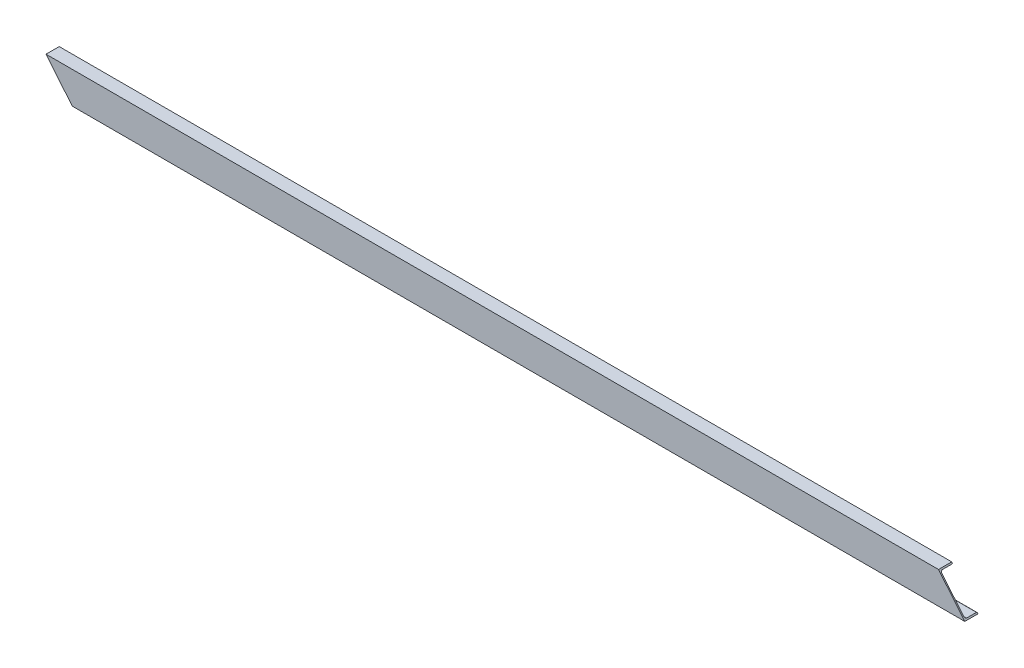
ISO-10303-21;
HEADER;
FILE_DESCRIPTION(('STEP AP214'),'2;1');
FILE_NAME('part.step','',(''),(''),'','','');
FILE_SCHEMA(('AUTOMOTIVE_DESIGN { 1 0 10303 214 1 1 1 1 }'));
ENDSEC;
DATA;
#1=APPLICATION_CONTEXT('core data for automotive mechanical design processes');
#2=APPLICATION_PROTOCOL_DEFINITION('international standard','automotive_design',2000,#1);
#3=PRODUCT_CONTEXT('',#1,'mechanical');
#4=PRODUCT('Part','Part','',(#3));
#5=PRODUCT_RELATED_PRODUCT_CATEGORY('part','',(#4));
#6=PRODUCT_DEFINITION_FORMATION('','',#4);
#7=PRODUCT_DEFINITION_CONTEXT('part definition',#1,'design');
#8=PRODUCT_DEFINITION('design','',#6,#7);
#9=PRODUCT_DEFINITION_SHAPE('','',#8);
#10=(LENGTH_UNIT() NAMED_UNIT(*) SI_UNIT(.MILLI.,.METRE.));
#11=(NAMED_UNIT(*) PLANE_ANGLE_UNIT() SI_UNIT($,.RADIAN.));
#12=(NAMED_UNIT(*) SI_UNIT($,.STERADIAN.) SOLID_ANGLE_UNIT());
#13=UNCERTAINTY_MEASURE_WITH_UNIT(LENGTH_MEASURE(1.E-05),#10,'distance_accuracy_value','');
#14=(GEOMETRIC_REPRESENTATION_CONTEXT(3) GLOBAL_UNCERTAINTY_ASSIGNED_CONTEXT((#13)) GLOBAL_UNIT_ASSIGNED_CONTEXT((#10,
#11,#12)) REPRESENTATION_CONTEXT('',''));
#15=CARTESIAN_POINT('',(0.,0.,0.));
#16=DIRECTION('',(0.,0.,1.));
#17=DIRECTION('',(1.,0.,0.));
#18=AXIS2_PLACEMENT_3D('',#15,#16,#17);
#19=CARTESIAN_POINT('',(4151.72857768436,-147.156136611384,58.));
#20=DIRECTION('',(0.,0.,-1.));
#21=DIRECTION('',(0.,1.,0.));
#22=AXIS2_PLACEMENT_3D('',#19,#20,#21);
#23=PLANE('',#22);
#24=DIRECTION('',(-1.,0.,0.));
#25=VECTOR('',#24,1.);
#26=CARTESIAN_POINT('',(4151.72857768436,-7.15613661138373,58.));
#27=LINE('',#26,#25);
#28=CARTESIAN_POINT('',(3920.04128798324,-7.15613661138372,58.));
#29=VERTEX_POINT('',#28);
#30=CARTESIAN_POINT('',(0.,-7.15613661138373,58.));
#31=VERTEX_POINT('',#30);
#32=EDGE_CURVE('E158',#29,#31,#27,.T.);
#33=ORIENTED_EDGE('',*,*,#32,.T.);
#34=DIRECTION('',(-0.636154901199818,0.771561366113837,0.));
#35=VECTOR('',#34,1.);
#36=CARTESIAN_POINT('',(0.,-7.15613661138373,58.));
#37=LINE('',#36,#35);
#38=CARTESIAN_POINT('',(115.430463576159,-147.156136611384,58.));
#39=VERTEX_POINT('',#38);
#40=EDGE_CURVE('E135',#39,#31,#37,.T.);
#41=ORIENTED_EDGE('',*,*,#40,.F.);
#42=DIRECTION('',(-1.,0.,0.));
#43=VECTOR('',#42,1.);
#44=CARTESIAN_POINT('',(4151.72857768436,-147.156136611384,58.));
#45=LINE('',#44,#43);
#46=CARTESIAN_POINT('',(4035.47175155939,-147.156136611384,58.));
#47=VERTEX_POINT('',#46);
#48=EDGE_CURVE('E141',#47,#39,#45,.T.);
#49=ORIENTED_EDGE('',*,*,#48,.F.);
#50=DIRECTION('',(-0.636154901199819,0.771561366113836,0.));
#51=VECTOR('',#50,1.);
#52=CARTESIAN_POINT('',(4082.52008207455,-204.21877040888,58.));
#53=LINE('',#52,#51);
#54=EDGE_CURVE('E44',#47,#29,#53,.T.);
#55=ORIENTED_EDGE('',*,*,#54,.T.);
#56=EDGE_LOOP('',(#33,#41,#49,#55));
#57=FACE_BOUND('',#56,.T.);
#58=ADVANCED_FACE('F40',(#57),#23,.F.);
#59=CARTESIAN_POINT('',(4151.72857768436,-7.15613661138373,58.));
#60=DIRECTION('',(0.,-1.,0.));
#61=DIRECTION('',(0.,0.,-1.));
#62=AXIS2_PLACEMENT_3D('',#59,#60,#61);
#63=PLANE('',#62);
#64=ORIENTED_EDGE('',*,*,#32,.F.);
#65=DIRECTION('',(0.,0.,-1.));
#66=VECTOR('',#65,1.);
#67=CARTESIAN_POINT('',(3920.04128798324,-7.15613661138373,57.9999999999999));
#68=LINE('',#67,#66);
#69=CARTESIAN_POINT('',(3920.04128798324,-7.15613661138376,0.));
#70=VERTEX_POINT('',#69);
#71=EDGE_CURVE('E156',#29,#70,#68,.T.);
#72=ORIENTED_EDGE('',*,*,#71,.T.);
#73=DIRECTION('',(-1.,0.,0.));
#74=VECTOR('',#73,1.);
#75=CARTESIAN_POINT('',(4151.72857768436,-7.15613661138376,0.));
#76=LINE('',#75,#74);
#77=CARTESIAN_POINT('',(0.,-7.15613661138373,0.));
#78=VERTEX_POINT('',#77);
#79=EDGE_CURVE('E149',#70,#78,#76,.T.);
#80=ORIENTED_EDGE('',*,*,#79,.T.);
#81=DIRECTION('',(0.,0.,1.));
#82=VECTOR('',#81,1.);
#83=CARTESIAN_POINT('',(0.,-7.15613661138373,58.));
#84=LINE('',#83,#82);
#85=EDGE_CURVE('E129',#78,#31,#84,.T.);
#86=ORIENTED_EDGE('',*,*,#85,.T.);
#87=EDGE_LOOP('',(#64,#72,#80,#86));
#88=FACE_BOUND('',#87,.T.);
#89=ADVANCED_FACE('F155',(#88),#63,.F.);
#90=CARTESIAN_POINT('',(4151.72857768436,-7.15613661138376,0.));
#91=DIRECTION('',(0.,0.,1.));
#92=DIRECTION('',(0.,-1.,0.));
#93=AXIS2_PLACEMENT_3D('',#90,#91,#92);
#94=PLANE('',#93);
#95=DIRECTION('',(-1.,0.,0.));
#96=VECTOR('',#95,1.);
#97=CARTESIAN_POINT('',(4151.72857768436,-9.05613661138375,0.));
#98=LINE('',#97,#96);
#99=CARTESIAN_POINT('',(3921.60784427463,-9.05613661138375,0.));
#100=VERTEX_POINT('',#99);
#101=CARTESIAN_POINT('',(1.56655629139103,-9.05613661138387,0.));
#102=VERTEX_POINT('',#101);
#103=EDGE_CURVE('E152',#100,#102,#98,.T.);
#104=ORIENTED_EDGE('',*,*,#103,.T.);
#105=DIRECTION('',(-0.636154901199818,0.771561366113837,0.));
#106=VECTOR('',#105,1.);
#107=CARTESIAN_POINT('',(0.,-7.15613661138373,0.));
#108=LINE('',#107,#106);
#109=EDGE_CURVE('E132',#102,#78,#108,.T.);
#110=ORIENTED_EDGE('',*,*,#109,.T.);
#111=ORIENTED_EDGE('',*,*,#79,.F.);
#112=DIRECTION('',(0.636154901199819,-0.771561366113836,0.));
#113=VECTOR('',#112,1.);
#114=CARTESIAN_POINT('',(4013.80352582638,-120.875798573757,-2.00716019029014E-13));
#115=LINE('',#114,#113);
#116=EDGE_CURVE('E206',#70,#100,#115,.T.);
#117=ORIENTED_EDGE('',*,*,#116,.T.);
#118=EDGE_LOOP('',(#104,#110,#111,#117));
#119=FACE_BOUND('',#118,.T.);
#120=ADVANCED_FACE('F147',(#119),#94,.F.);
#121=CARTESIAN_POINT('',(4151.72857768436,-9.05613661138375,3.00000000000001));
#122=DIRECTION('',(-1.,0.,0.));
#123=DIRECTION('',(0.,0.,1.));
#124=AXIS2_PLACEMENT_3D('',#121,#122,#123);
#125=CYLINDRICAL_SURFACE('',#124,3.);
#126=DIRECTION('',(-1.,0.,0.));
#127=VECTOR('',#126,1.);
#128=CARTESIAN_POINT('',(4151.72857768436,-12.0561366113838,3.00000000000001));
#129=LINE('',#128,#127);
#130=CARTESIAN_POINT('',(3924.0813542084,-12.0561366113838,3.00000000000001));
#131=VERTEX_POINT('',#130);
#132=CARTESIAN_POINT('',(4.04006622516562,-12.0561366113838,3.00000000000001));
#133=VERTEX_POINT('',#132);
#134=EDGE_CURVE('E163',#131,#133,#129,.T.);
#135=ORIENTED_EDGE('',*,*,#134,.T.);
#136=CARTESIAN_POINT('',(1.56655629139024,-9.05613661138375,3.00000000000001));
#137=DIRECTION('',(0.771561366113837,0.636154901199818,0.));
#138=DIRECTION('',(-0.636154901199818,0.771561366113837,0.));
#139=AXIS2_PLACEMENT_3D('',#136,#137,#138);
#140=ELLIPSE('',#139,3.88821956587881,3.);
#141=EDGE_CURVE('E142',#133,#102,#140,.T.);
#142=ORIENTED_EDGE('',*,*,#141,.T.);
#143=ORIENTED_EDGE('',*,*,#103,.F.);
#144=CARTESIAN_POINT('',(3921.60784427463,-9.05613661138375,3.00000000000001));
#145=DIRECTION('',(-0.771561366113836,-0.636154901199819,0.));
#146=DIRECTION('',(-0.636154901199819,0.771561366113836,0.));
#147=AXIS2_PLACEMENT_3D('',#144,#145,#146);
#148=ELLIPSE('',#147,3.88821956587881,3.);
#149=EDGE_CURVE('E210',#100,#131,#148,.T.);
#150=ORIENTED_EDGE('',*,*,#149,.T.);
#151=EDGE_LOOP('',(#135,#142,#143,#150));
#152=FACE_BOUND('',#151,.T.);
#153=ADVANCED_FACE('F282',(#152),#125,.T.);
#154=CARTESIAN_POINT('',(4151.72857768436,-12.0561366113838,3.00000000000001));
#155=DIRECTION('',(0.,1.,0.));
#156=DIRECTION('',(0.,0.,1.));
#157=AXIS2_PLACEMENT_3D('',#154,#155,#156);
#158=PLANE('',#157);
#159=DIRECTION('',(-1.,0.,0.));
#160=VECTOR('',#159,1.);
#161=CARTESIAN_POINT('',(4151.72857768436,-12.0561366113838,45.1));
#162=LINE('',#161,#160);
#163=CARTESIAN_POINT('',(3924.0813542084,-12.0561366113838,45.1));
#164=VERTEX_POINT('',#163);
#165=CARTESIAN_POINT('',(4.04006622516562,-12.0561366113838,45.1));
#166=VERTEX_POINT('',#165);
#167=EDGE_CURVE('E171',#164,#166,#162,.T.);
#168=ORIENTED_EDGE('',*,*,#167,.T.);
#169=DIRECTION('',(0.,0.,-1.));
#170=VECTOR('',#169,1.);
#171=CARTESIAN_POINT('',(4.04006622516562,-12.0561366113838,3.00000000000114));
#172=LINE('',#171,#170);
#173=EDGE_CURVE('E273',#166,#133,#172,.T.);
#174=ORIENTED_EDGE('',*,*,#173,.T.);
#175=ORIENTED_EDGE('',*,*,#134,.F.);
#176=DIRECTION('',(0.,0.,1.));
#177=VECTOR('',#176,1.);
#178=CARTESIAN_POINT('',(3924.0813542084,-12.0561366113838,3.00000000000007));
#179=LINE('',#178,#177);
#180=EDGE_CURVE('E218',#131,#164,#179,.T.);
#181=ORIENTED_EDGE('',*,*,#180,.T.);
#182=EDGE_LOOP('',(#168,#174,#175,#181));
#183=FACE_BOUND('',#182,.T.);
#184=ADVANCED_FACE('F287',(#183),#158,.F.);
#185=CARTESIAN_POINT('',(4151.72857768436,-20.0561366113838,45.1));
#186=DIRECTION('',(-1.,0.,0.));
#187=DIRECTION('',(0.,0.,1.));
#188=AXIS2_PLACEMENT_3D('',#185,#186,#187);
#189=CYLINDRICAL_SURFACE('',#188,8.);
#190=DIRECTION('',(-1.,0.,0.));
#191=VECTOR('',#190,1.);
#192=CARTESIAN_POINT('',(4151.72857768436,-20.0561366113838,53.1));
#193=LINE('',#192,#191);
#194=CARTESIAN_POINT('',(3930.67738069847,-20.0561366113838,53.1));
#195=VERTEX_POINT('',#194);
#196=CARTESIAN_POINT('',(10.636092715232,-20.0561366113838,53.1));
#197=VERTEX_POINT('',#196);
#198=EDGE_CURVE('E175',#195,#197,#193,.T.);
#199=ORIENTED_EDGE('',*,*,#198,.T.);
#200=CARTESIAN_POINT('',(10.6360927152318,-20.0561366113838,45.1));
#201=DIRECTION('',(0.771561366113837,0.636154901199818,0.));
#202=DIRECTION('',(-0.636154901199818,0.771561366113837,0.));
#203=AXIS2_PLACEMENT_3D('',#200,#201,#202);
#204=ELLIPSE('',#203,10.3685855090101,8.);
#205=EDGE_CURVE('E270',#197,#166,#204,.F.);
#206=ORIENTED_EDGE('',*,*,#205,.T.);
#207=ORIENTED_EDGE('',*,*,#167,.F.);
#208=CARTESIAN_POINT('',(3930.67738069847,-20.0561366113838,45.1));
#209=DIRECTION('',(-0.771561366113836,-0.636154901199819,0.));
#210=DIRECTION('',(-0.636154901199819,0.771561366113836,0.));
#211=AXIS2_PLACEMENT_3D('',#208,#209,#210);
#212=ELLIPSE('',#211,10.3685855090101,8.);
#213=EDGE_CURVE('E222',#164,#195,#212,.F.);
#214=ORIENTED_EDGE('',*,*,#213,.T.);
#215=EDGE_LOOP('',(#199,#206,#207,#214));
#216=FACE_BOUND('',#215,.T.);
#217=ADVANCED_FACE('F285',(#216),#189,.F.);
#218=CARTESIAN_POINT('',(4151.72857768436,-20.0561366113838,53.1));
#219=DIRECTION('',(0.,0.,1.));
#220=DIRECTION('',(0.,-1.,0.));
#221=AXIS2_PLACEMENT_3D('',#218,#219,#220);
#222=PLANE('',#221);
#223=DIRECTION('',(-1.,0.,0.));
#224=VECTOR('',#223,1.);
#225=CARTESIAN_POINT('',(4151.72857768436,-134.256136611384,53.1));
#226=LINE('',#225,#224);
#227=CARTESIAN_POINT('',(4024.83565884416,-134.256136611384,53.1));
#228=VERTEX_POINT('',#227);
#229=CARTESIAN_POINT('',(104.794370860926,-134.256136611384,53.1));
#230=VERTEX_POINT('',#229);
#231=EDGE_CURVE('E179',#228,#230,#226,.T.);
#232=ORIENTED_EDGE('',*,*,#231,.T.);
#233=DIRECTION('',(-0.636154901199818,0.771561366113837,0.));
#234=VECTOR('',#233,1.);
#235=CARTESIAN_POINT('',(1686.50747524564,-2052.63909855589,53.0999999999999));
#236=LINE('',#235,#234);
#237=EDGE_CURVE('E266',#230,#197,#236,.T.);
#238=ORIENTED_EDGE('',*,*,#237,.T.);
#239=ORIENTED_EDGE('',*,*,#198,.F.);
#240=DIRECTION('',(0.636154901199819,-0.771561366113836,0.));
#241=VECTOR('',#240,1.);
#242=CARTESIAN_POINT('',(4020.13526565211,-128.555258121422,53.1));
#243=LINE('',#242,#241);
#244=EDGE_CURVE('E226',#195,#228,#243,.T.);
#245=ORIENTED_EDGE('',*,*,#244,.T.);
#246=EDGE_LOOP('',(#232,#238,#239,#245));
#247=FACE_BOUND('',#246,.T.);
#248=ADVANCED_FACE('F291',(#247),#222,.F.);
#249=CARTESIAN_POINT('',(4151.72857768436,-134.256136611384,45.1));
#250=DIRECTION('',(-1.,0.,0.));
#251=DIRECTION('',(0.,0.,1.));
#252=AXIS2_PLACEMENT_3D('',#249,#250,#251);
#253=CYLINDRICAL_SURFACE('',#252,7.99999999999999);
#254=DIRECTION('',(-1.,0.,0.));
#255=VECTOR('',#254,1.);
#256=CARTESIAN_POINT('',(4151.72857768436,-142.256136611384,45.1));
#257=LINE('',#256,#255);
#258=CARTESIAN_POINT('',(4031.43168533423,-142.256136611384,45.1));
#259=VERTEX_POINT('',#258);
#260=CARTESIAN_POINT('',(111.390397350993,-142.256136611384,45.1));
#261=VERTEX_POINT('',#260);
#262=EDGE_CURVE('E183',#259,#261,#257,.T.);
#263=ORIENTED_EDGE('',*,*,#262,.T.);
#264=CARTESIAN_POINT('',(104.794370860926,-134.256136611384,45.1));
#265=DIRECTION('',(0.771561366113837,0.636154901199818,0.));
#266=DIRECTION('',(-0.636154901199818,0.771561366113837,0.));
#267=AXIS2_PLACEMENT_3D('',#264,#265,#266);
#268=ELLIPSE('',#267,10.3685855090101,7.99999999999999);
#269=EDGE_CURVE('E262',#261,#230,#268,.F.);
#270=ORIENTED_EDGE('',*,*,#269,.T.);
#271=ORIENTED_EDGE('',*,*,#231,.F.);
#272=CARTESIAN_POINT('',(4024.83565884416,-134.256136611384,45.1));
#273=DIRECTION('',(-0.771561366113836,-0.636154901199819,0.));
#274=DIRECTION('',(-0.636154901199819,0.771561366113836,0.));
#275=AXIS2_PLACEMENT_3D('',#272,#273,#274);
#276=ELLIPSE('',#275,10.3685855090101,7.99999999999999);
#277=EDGE_CURVE('E230',#228,#259,#276,.F.);
#278=ORIENTED_EDGE('',*,*,#277,.T.);
#279=EDGE_LOOP('',(#263,#270,#271,#278));
#280=FACE_BOUND('',#279,.T.);
#281=ADVANCED_FACE('F293',(#280),#253,.F.);
#282=CARTESIAN_POINT('',(4151.72857768436,-142.256136611384,3.00000000000002));
#283=DIRECTION('',(0.,-1.,0.));
#284=DIRECTION('',(0.,0.,-1.));
#285=AXIS2_PLACEMENT_3D('',#282,#283,#284);
#286=PLANE('',#285);
#287=DIRECTION('',(-1.,0.,0.));
#288=VECTOR('',#287,1.);
#289=CARTESIAN_POINT('',(4151.72857768436,-142.256136611384,3.00000000000002));
#290=LINE('',#289,#288);
#291=CARTESIAN_POINT('',(4031.43168533423,-142.256136611384,3.00000000000002));
#292=VERTEX_POINT('',#291);
#293=CARTESIAN_POINT('',(111.390397350993,-142.256136611384,3.00000000000002));
#294=VERTEX_POINT('',#293);
#295=EDGE_CURVE('E187',#292,#294,#290,.T.);
#296=ORIENTED_EDGE('',*,*,#295,.T.);
#297=DIRECTION('',(0.,0.,1.));
#298=VECTOR('',#297,1.);
#299=CARTESIAN_POINT('',(111.390397350993,-142.256136611384,2.99999999999343));
#300=LINE('',#299,#298);
#301=EDGE_CURVE('E258',#294,#261,#300,.T.);
#302=ORIENTED_EDGE('',*,*,#301,.T.);
#303=ORIENTED_EDGE('',*,*,#262,.F.);
#304=DIRECTION('',(0.,0.,-1.));
#305=VECTOR('',#304,1.);
#306=CARTESIAN_POINT('',(4031.43168533423,-142.256136611384,2.99999999999982));
#307=LINE('',#306,#305);
#308=EDGE_CURVE('E234',#259,#292,#307,.T.);
#309=ORIENTED_EDGE('',*,*,#308,.T.);
#310=EDGE_LOOP('',(#296,#302,#303,#309));
#311=FACE_BOUND('',#310,.T.);
#312=ADVANCED_FACE('F296',(#311),#286,.F.);
#313=CARTESIAN_POINT('',(4151.72857768436,-145.256136611384,3.00000000000002));
#314=DIRECTION('',(-1.,0.,0.));
#315=DIRECTION('',(0.,0.,1.));
#316=AXIS2_PLACEMENT_3D('',#313,#314,#315);
#317=CYLINDRICAL_SURFACE('',#316,3.);
#318=DIRECTION('',(-1.,0.,0.));
#319=VECTOR('',#318,1.);
#320=CARTESIAN_POINT('',(4151.72857768436,-145.256136611384,0.));
#321=LINE('',#320,#319);
#322=CARTESIAN_POINT('',(4033.905195268,-145.256136611384,0.));
#323=VERTEX_POINT('',#322);
#324=CARTESIAN_POINT('',(113.863907284768,-145.256136611383,0.));
#325=VERTEX_POINT('',#324);
#326=EDGE_CURVE('E191',#323,#325,#321,.T.);
#327=ORIENTED_EDGE('',*,*,#326,.T.);
#328=CARTESIAN_POINT('',(113.863907284768,-145.256136611384,3.00000000000002));
#329=DIRECTION('',(0.771561366113837,0.636154901199818,0.));
#330=DIRECTION('',(-0.636154901199818,0.771561366113837,0.));
#331=AXIS2_PLACEMENT_3D('',#328,#329,#330);
#332=ELLIPSE('',#331,3.8882195658788,3.);
#333=EDGE_CURVE('E254',#325,#294,#332,.T.);
#334=ORIENTED_EDGE('',*,*,#333,.T.);
#335=ORIENTED_EDGE('',*,*,#295,.F.);
#336=CARTESIAN_POINT('',(4033.905195268,-145.256136611384,3.00000000000002));
#337=DIRECTION('',(-0.771561366113836,-0.636154901199819,0.));
#338=DIRECTION('',(-0.636154901199819,0.771561366113836,0.));
#339=AXIS2_PLACEMENT_3D('',#336,#337,#338);
#340=ELLIPSE('',#339,3.88821956587881,3.);
#341=EDGE_CURVE('E238',#292,#323,#340,.T.);
#342=ORIENTED_EDGE('',*,*,#341,.T.);
#343=EDGE_LOOP('',(#327,#334,#335,#342));
#344=FACE_BOUND('',#343,.T.);
#345=ADVANCED_FACE('F299',(#344),#317,.T.);
#346=CARTESIAN_POINT('',(4151.72857768436,-147.156136611384,0.));
#347=DIRECTION('',(0.,0.,1.));
#348=DIRECTION('',(0.,-1.,0.));
#349=AXIS2_PLACEMENT_3D('',#346,#347,#348);
#350=PLANE('',#349);
#351=DIRECTION('',(-1.,0.,0.));
#352=VECTOR('',#351,1.);
#353=CARTESIAN_POINT('',(4151.72857768436,-147.156136611384,0.));
#354=LINE('',#353,#352);
#355=CARTESIAN_POINT('',(4035.47175155939,-147.156136611384,0.));
#356=VERTEX_POINT('',#355);
#357=CARTESIAN_POINT('',(115.430463576159,-147.156136611384,0.));
#358=VERTEX_POINT('',#357);
#359=EDGE_CURVE('E194',#356,#358,#354,.T.);
#360=ORIENTED_EDGE('',*,*,#359,.T.);
#361=EDGE_CURVE('E58',#358,#325,#108,.T.);
#362=ORIENTED_EDGE('',*,*,#361,.T.);
#363=ORIENTED_EDGE('',*,*,#326,.F.);
#364=DIRECTION('',(0.636154901199819,-0.771561366113836,0.));
#365=VECTOR('',#364,1.);
#366=CARTESIAN_POINT('',(4082.52008207455,-204.21877040888,-6.25186676523692E-13));
#367=LINE('',#366,#365);
#368=EDGE_CURVE('E50',#323,#356,#367,.T.);
#369=ORIENTED_EDGE('',*,*,#368,.T.);
#370=EDGE_LOOP('',(#360,#362,#363,#369));
#371=FACE_BOUND('',#370,.T.);
#372=ADVANCED_FACE('F300',(#371),#350,.F.);
#373=CARTESIAN_POINT('',(4151.72857768436,-147.156136611384,58.));
#374=DIRECTION('',(0.,1.,0.));
#375=DIRECTION('',(0.,0.,1.));
#376=AXIS2_PLACEMENT_3D('',#373,#374,#375);
#377=PLANE('',#376);
#378=ORIENTED_EDGE('',*,*,#48,.T.);
#379=DIRECTION('',(0.,0.,1.));
#380=VECTOR('',#379,1.);
#381=CARTESIAN_POINT('',(115.430463576159,-147.156136611384,0.));
#382=LINE('',#381,#380);
#383=EDGE_CURVE('E247',#358,#39,#382,.T.);
#384=ORIENTED_EDGE('',*,*,#383,.F.);
#385=ORIENTED_EDGE('',*,*,#359,.F.);
#386=DIRECTION('',(0.,0.,1.));
#387=VECTOR('',#386,1.);
#388=CARTESIAN_POINT('',(4035.47175155939,-147.156136611384,58.));
#389=LINE('',#388,#387);
#390=EDGE_CURVE('E11',#356,#47,#389,.T.);
#391=ORIENTED_EDGE('',*,*,#390,.T.);
#392=EDGE_LOOP('',(#378,#384,#385,#391));
#393=FACE_BOUND('',#392,.T.);
#394=ADVANCED_FACE('F42',(#393),#377,.F.);
#395=CARTESIAN_POINT('',(2330.11532566379,1921.18780162345,0.));
#396=DIRECTION('',(-0.771561366113836,-0.636154901199819,0.));
#397=DIRECTION('',(0.636154901199819,-0.771561366113836,0.));
#398=AXIS2_PLACEMENT_3D('',#395,#396,#397);
#399=PLANE('',#398);
#400=ORIENTED_EDGE('',*,*,#368,.F.);
#401=ORIENTED_EDGE('',*,*,#341,.F.);
#402=ORIENTED_EDGE('',*,*,#308,.F.);
#403=ORIENTED_EDGE('',*,*,#277,.F.);
#404=ORIENTED_EDGE('',*,*,#244,.F.);
#405=ORIENTED_EDGE('',*,*,#213,.F.);
#406=ORIENTED_EDGE('',*,*,#180,.F.);
#407=ORIENTED_EDGE('',*,*,#149,.F.);
#408=ORIENTED_EDGE('',*,*,#116,.F.);
#409=ORIENTED_EDGE('',*,*,#71,.F.);
#410=ORIENTED_EDGE('',*,*,#54,.F.);
#411=ORIENTED_EDGE('',*,*,#390,.F.);
#412=EDGE_LOOP('',(#400,#401,#402,#403,#404,#405,#406,#407,#408,#409,#410,#411));
#413=FACE_BOUND('',#412,.T.);
#414=ADVANCED_FACE('F288',(#413),#399,.F.);
#415=CARTESIAN_POINT('',(0.,-7.15613661138373,0.));
#416=DIRECTION('',(0.771561366113837,0.636154901199818,0.));
#417=DIRECTION('',(-0.636154901199818,0.771561366113837,0.));
#418=AXIS2_PLACEMENT_3D('',#415,#416,#417);
#419=PLANE('',#418);
#420=ORIENTED_EDGE('',*,*,#173,.F.);
#421=ORIENTED_EDGE('',*,*,#205,.F.);
#422=ORIENTED_EDGE('',*,*,#237,.F.);
#423=ORIENTED_EDGE('',*,*,#269,.F.);
#424=ORIENTED_EDGE('',*,*,#301,.F.);
#425=ORIENTED_EDGE('',*,*,#333,.F.);
#426=ORIENTED_EDGE('',*,*,#361,.F.);
#427=ORIENTED_EDGE('',*,*,#383,.T.);
#428=ORIENTED_EDGE('',*,*,#40,.T.);
#429=ORIENTED_EDGE('',*,*,#85,.F.);
#430=ORIENTED_EDGE('',*,*,#109,.F.);
#431=ORIENTED_EDGE('',*,*,#141,.F.);
#432=EDGE_LOOP('',(#420,#421,#422,#423,#424,#425,#426,#427,#428,#429,#430,#431));
#433=FACE_BOUND('',#432,.T.);
#434=ADVANCED_FACE('F131',(#433),#419,.F.);
#435=CLOSED_SHELL('',(#58,#89,#120,#153,#184,#217,#248,#281,#312,#345,#372,#394,#414,#434));
#436=MANIFOLD_SOLID_BREP('B2',#435);
#437=ADVANCED_BREP_SHAPE_REPRESENTATION('',(#18,#436),#14);
#438=SHAPE_DEFINITION_REPRESENTATION(#9,#437);
ENDSEC;
END-ISO-10303-21;
